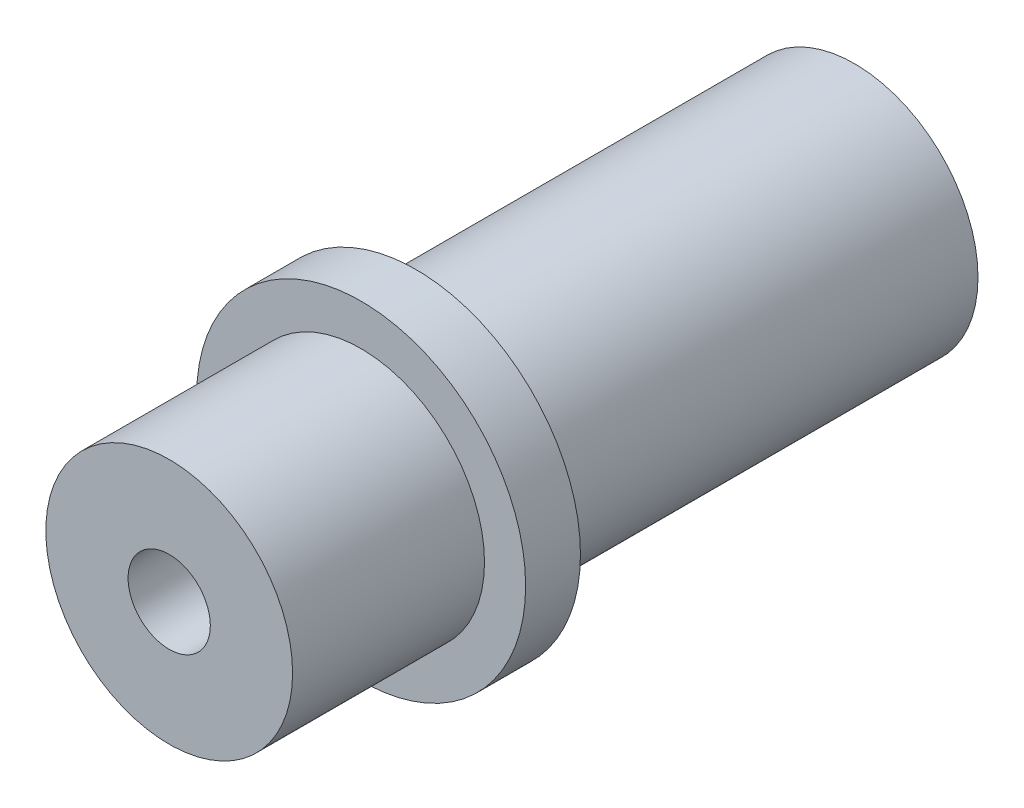
ISO-10303-21;
HEADER;
FILE_DESCRIPTION(('STEP AP214'),'2;1');
FILE_NAME('part.step','',(''),(''),'','','');
FILE_SCHEMA(('AUTOMOTIVE_DESIGN { 1 0 10303 214 1 1 1 1 }'));
ENDSEC;
DATA;
#1=APPLICATION_CONTEXT('core data for automotive mechanical design processes');
#2=APPLICATION_PROTOCOL_DEFINITION('international standard','automotive_design',2000,#1);
#3=PRODUCT_CONTEXT('',#1,'mechanical');
#4=PRODUCT('Part','Part','',(#3));
#5=PRODUCT_RELATED_PRODUCT_CATEGORY('part','',(#4));
#6=PRODUCT_DEFINITION_FORMATION('','',#4);
#7=PRODUCT_DEFINITION_CONTEXT('part definition',#1,'design');
#8=PRODUCT_DEFINITION('design','',#6,#7);
#9=PRODUCT_DEFINITION_SHAPE('','',#8);
#10=(LENGTH_UNIT() NAMED_UNIT(*) SI_UNIT(.MILLI.,.METRE.));
#11=(NAMED_UNIT(*) PLANE_ANGLE_UNIT() SI_UNIT($,.RADIAN.));
#12=(NAMED_UNIT(*) SI_UNIT($,.STERADIAN.) SOLID_ANGLE_UNIT());
#13=UNCERTAINTY_MEASURE_WITH_UNIT(LENGTH_MEASURE(1.E-05),#10,'distance_accuracy_value','');
#14=(GEOMETRIC_REPRESENTATION_CONTEXT(3) GLOBAL_UNCERTAINTY_ASSIGNED_CONTEXT((#13)) GLOBAL_UNIT_ASSIGNED_CONTEXT((#10,
#11,#12)) REPRESENTATION_CONTEXT('',''));
#15=CARTESIAN_POINT('',(0.,0.,0.));
#16=DIRECTION('',(0.,0.,1.));
#17=DIRECTION('',(1.,0.,0.));
#18=AXIS2_PLACEMENT_3D('',#15,#16,#17);
#19=CARTESIAN_POINT('',(0.,5.625,3.88429752066116));
#20=DIRECTION('',(0.,0.,-1.));
#21=DIRECTION('',(-1.,0.,0.));
#22=AXIS2_PLACEMENT_3D('',#19,#20,#21);
#23=PLANE('',#22);
#24=CARTESIAN_POINT('',(0.,0.,3.88429752066116));
#25=DIRECTION('',(0.,0.,1.));
#26=DIRECTION('',(1.,0.,0.));
#27=AXIS2_PLACEMENT_3D('',#24,#25,#26);
#28=CIRCLE('',#27,1.875);
#29=CARTESIAN_POINT('',(1.875,0.,3.88429752066116));
#30=VERTEX_POINT('',#29);
#31=EDGE_CURVE('E10',#30,#30,#28,.T.);
#32=ORIENTED_EDGE('',*,*,#31,.F.);
#33=EDGE_LOOP('',(#32));
#34=FACE_BOUND('',#33,.T.);
#35=CARTESIAN_POINT('',(0.,0.,3.88429752066116));
#36=DIRECTION('',(0.,0.,1.));
#37=DIRECTION('',(1.,0.,0.));
#38=AXIS2_PLACEMENT_3D('',#35,#36,#37);
#39=CIRCLE('',#38,5.625);
#40=CARTESIAN_POINT('',(5.625,0.,3.88429752066116));
#41=VERTEX_POINT('',#40);
#42=EDGE_CURVE('E78',#41,#41,#39,.T.);
#43=ORIENTED_EDGE('',*,*,#42,.T.);
#44=EDGE_LOOP('',(#43));
#45=FACE_BOUND('',#44,.T.);
#46=ADVANCED_FACE('F43',(#34,#45),#23,.F.);
#47=CARTESIAN_POINT('',(0.,0.,4.3801652892562));
#48=DIRECTION('',(0.,0.,1.));
#49=DIRECTION('',(1.,0.,0.));
#50=AXIS2_PLACEMENT_3D('',#47,#48,#49);
#51=CYLINDRICAL_SURFACE('',#50,1.875);
#52=CARTESIAN_POINT('',(0.,0.,-27.3657024793388));
#53=DIRECTION('',(0.,0.,1.));
#54=DIRECTION('',(1.,0.,0.));
#55=AXIS2_PLACEMENT_3D('',#52,#53,#54);
#56=CIRCLE('',#55,1.875);
#57=CARTESIAN_POINT('',(1.875,0.,-27.3657024793388));
#58=VERTEX_POINT('',#57);
#59=EDGE_CURVE('E50',#58,#58,#56,.T.);
#60=ORIENTED_EDGE('',*,*,#59,.F.);
#61=EDGE_LOOP('',(#60));
#62=FACE_BOUND('',#61,.T.);
#63=ORIENTED_EDGE('',*,*,#31,.T.);
#64=EDGE_LOOP('',(#63));
#65=FACE_BOUND('',#64,.T.);
#66=ADVANCED_FACE('F116',(#62,#65),#51,.F.);
#67=CARTESIAN_POINT('',(0.,5.625,-27.3657024793388));
#68=DIRECTION('',(0.,0.,1.));
#69=DIRECTION('',(1.,0.,0.));
#70=AXIS2_PLACEMENT_3D('',#67,#68,#69);
#71=PLANE('',#70);
#72=CARTESIAN_POINT('',(0.,0.,-27.3657024793388));
#73=DIRECTION('',(0.,0.,1.));
#74=DIRECTION('',(1.,0.,0.));
#75=AXIS2_PLACEMENT_3D('',#72,#73,#74);
#76=CIRCLE('',#75,5.625);
#77=CARTESIAN_POINT('',(5.625,0.,-27.3657024793388));
#78=VERTEX_POINT('',#77);
#79=EDGE_CURVE('E55',#78,#78,#76,.T.);
#80=ORIENTED_EDGE('',*,*,#79,.F.);
#81=EDGE_LOOP('',(#80));
#82=FACE_BOUND('',#81,.T.);
#83=ORIENTED_EDGE('',*,*,#59,.T.);
#84=EDGE_LOOP('',(#83));
#85=FACE_BOUND('',#84,.T.);
#86=ADVANCED_FACE('F111',(#82,#85),#71,.F.);
#87=CARTESIAN_POINT('',(0.,0.,4.3801652892562));
#88=DIRECTION('',(0.,0.,1.));
#89=DIRECTION('',(1.,0.,0.));
#90=AXIS2_PLACEMENT_3D('',#87,#88,#89);
#91=CYLINDRICAL_SURFACE('',#90,5.625);
#92=CARTESIAN_POINT('',(0.,0.,-7.36570247933884));
#93=DIRECTION('',(0.,0.,1.));
#94=DIRECTION('',(1.,0.,0.));
#95=AXIS2_PLACEMENT_3D('',#92,#93,#94);
#96=CIRCLE('',#95,5.625);
#97=CARTESIAN_POINT('',(5.625,0.,-7.36570247933884));
#98=VERTEX_POINT('',#97);
#99=EDGE_CURVE('E60',#98,#98,#96,.T.);
#100=ORIENTED_EDGE('',*,*,#99,.F.);
#101=EDGE_LOOP('',(#100));
#102=FACE_BOUND('',#101,.T.);
#103=ORIENTED_EDGE('',*,*,#79,.T.);
#104=EDGE_LOOP('',(#103));
#105=FACE_BOUND('',#104,.T.);
#106=ADVANCED_FACE('F105',(#102,#105),#91,.T.);
#107=CARTESIAN_POINT('',(0.,7.5,-7.36570247933884));
#108=DIRECTION('',(0.,0.,1.));
#109=DIRECTION('',(1.,0.,0.));
#110=AXIS2_PLACEMENT_3D('',#107,#108,#109);
#111=PLANE('',#110);
#112=CARTESIAN_POINT('',(0.,0.,-7.36570247933884));
#113=DIRECTION('',(0.,0.,1.));
#114=DIRECTION('',(1.,0.,0.));
#115=AXIS2_PLACEMENT_3D('',#112,#113,#114);
#116=CIRCLE('',#115,7.5);
#117=CARTESIAN_POINT('',(7.5,0.,-7.36570247933884));
#118=VERTEX_POINT('',#117);
#119=EDGE_CURVE('E66',#118,#118,#116,.T.);
#120=ORIENTED_EDGE('',*,*,#119,.F.);
#121=EDGE_LOOP('',(#120));
#122=FACE_BOUND('',#121,.T.);
#123=ORIENTED_EDGE('',*,*,#99,.T.);
#124=EDGE_LOOP('',(#123));
#125=FACE_BOUND('',#124,.T.);
#126=ADVANCED_FACE('F99',(#122,#125),#111,.F.);
#127=CARTESIAN_POINT('',(0.,0.,4.3801652892562));
#128=DIRECTION('',(0.,0.,1.));
#129=DIRECTION('',(1.,0.,0.));
#130=AXIS2_PLACEMENT_3D('',#127,#128,#129);
#131=CYLINDRICAL_SURFACE('',#130,7.5);
#132=CARTESIAN_POINT('',(0.,0.,-4.86570247933884));
#133=DIRECTION('',(0.,0.,1.));
#134=DIRECTION('',(1.,0.,0.));
#135=AXIS2_PLACEMENT_3D('',#132,#133,#134);
#136=CIRCLE('',#135,7.5);
#137=CARTESIAN_POINT('',(7.5,0.,-4.86570247933884));
#138=VERTEX_POINT('',#137);
#139=EDGE_CURVE('E70',#138,#138,#136,.T.);
#140=ORIENTED_EDGE('',*,*,#139,.F.);
#141=EDGE_LOOP('',(#140));
#142=FACE_BOUND('',#141,.T.);
#143=ORIENTED_EDGE('',*,*,#119,.T.);
#144=EDGE_LOOP('',(#143));
#145=FACE_BOUND('',#144,.T.);
#146=ADVANCED_FACE('F93',(#142,#145),#131,.T.);
#147=CARTESIAN_POINT('',(0.,7.5,-4.86570247933884));
#148=DIRECTION('',(0.,0.,-1.));
#149=DIRECTION('',(-1.,0.,0.));
#150=AXIS2_PLACEMENT_3D('',#147,#148,#149);
#151=PLANE('',#150);
#152=CARTESIAN_POINT('',(0.,0.,-4.86570247933884));
#153=DIRECTION('',(0.,0.,1.));
#154=DIRECTION('',(1.,0.,0.));
#155=AXIS2_PLACEMENT_3D('',#152,#153,#154);
#156=CIRCLE('',#155,5.625);
#157=CARTESIAN_POINT('',(5.625,0.,-4.86570247933884));
#158=VERTEX_POINT('',#157);
#159=EDGE_CURVE('E74',#158,#158,#156,.T.);
#160=ORIENTED_EDGE('',*,*,#159,.F.);
#161=EDGE_LOOP('',(#160));
#162=FACE_BOUND('',#161,.T.);
#163=ORIENTED_EDGE('',*,*,#139,.T.);
#164=EDGE_LOOP('',(#163));
#165=FACE_BOUND('',#164,.T.);
#166=ADVANCED_FACE('F87',(#162,#165),#151,.F.);
#167=CARTESIAN_POINT('',(0.,0.,4.3801652892562));
#168=DIRECTION('',(0.,0.,1.));
#169=DIRECTION('',(1.,0.,0.));
#170=AXIS2_PLACEMENT_3D('',#167,#168,#169);
#171=CYLINDRICAL_SURFACE('',#170,5.625);
#172=ORIENTED_EDGE('',*,*,#42,.F.);
#173=EDGE_LOOP('',(#172));
#174=FACE_BOUND('',#173,.T.);
#175=ORIENTED_EDGE('',*,*,#159,.T.);
#176=EDGE_LOOP('',(#175));
#177=FACE_BOUND('',#176,.T.);
#178=ADVANCED_FACE('F84',(#174,#177),#171,.T.);
#179=CLOSED_SHELL('',(#46,#66,#86,#106,#126,#146,#166,#178));
#180=MANIFOLD_SOLID_BREP('B2',#179);
#181=ADVANCED_BREP_SHAPE_REPRESENTATION('',(#18,#180),#14);
#182=SHAPE_DEFINITION_REPRESENTATION(#9,#181);
ENDSEC;
END-ISO-10303-21;
